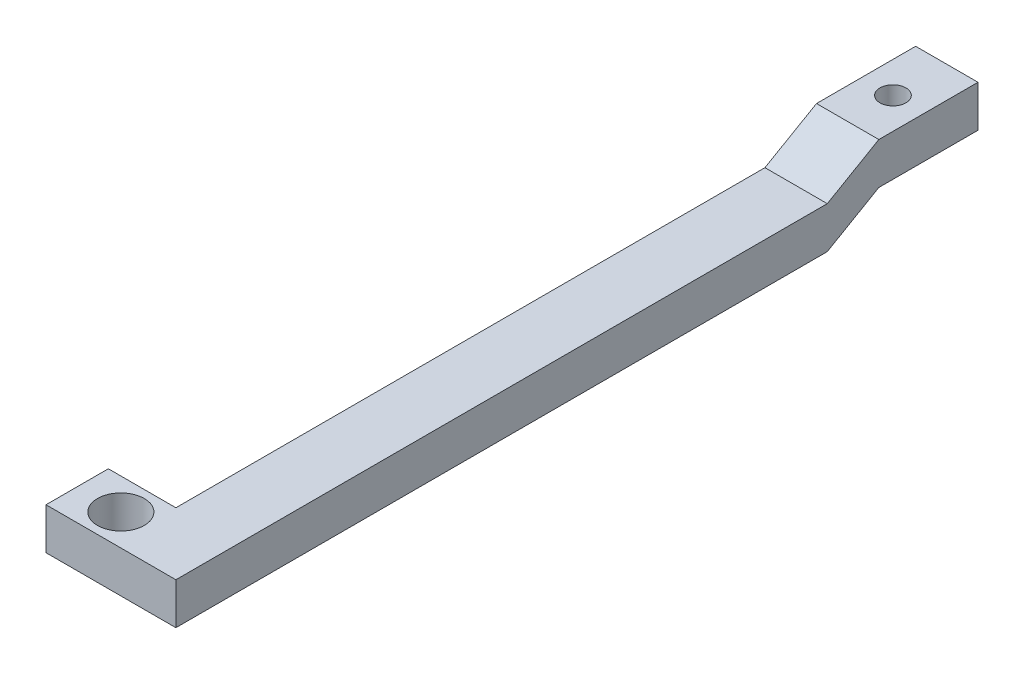
ISO-10303-21;
HEADER;
FILE_DESCRIPTION(('STEP AP214'),'2;1');
FILE_NAME('part.step','',(''),(''),'','','');
FILE_SCHEMA(('AUTOMOTIVE_DESIGN { 1 0 10303 214 1 1 1 1 }'));
ENDSEC;
DATA;
#1=APPLICATION_CONTEXT('core data for automotive mechanical design processes');
#2=APPLICATION_PROTOCOL_DEFINITION('international standard','automotive_design',2000,#1);
#3=PRODUCT_CONTEXT('',#1,'mechanical');
#4=PRODUCT('Part','Part','',(#3));
#5=PRODUCT_RELATED_PRODUCT_CATEGORY('part','',(#4));
#6=PRODUCT_DEFINITION_FORMATION('','',#4);
#7=PRODUCT_DEFINITION_CONTEXT('part definition',#1,'design');
#8=PRODUCT_DEFINITION('design','',#6,#7);
#9=PRODUCT_DEFINITION_SHAPE('','',#8);
#10=(LENGTH_UNIT() NAMED_UNIT(*) SI_UNIT(.MILLI.,.METRE.));
#11=(NAMED_UNIT(*) PLANE_ANGLE_UNIT() SI_UNIT($,.RADIAN.));
#12=(NAMED_UNIT(*) SI_UNIT($,.STERADIAN.) SOLID_ANGLE_UNIT());
#13=UNCERTAINTY_MEASURE_WITH_UNIT(LENGTH_MEASURE(1.E-05),#10,'distance_accuracy_value','');
#14=(GEOMETRIC_REPRESENTATION_CONTEXT(3) GLOBAL_UNCERTAINTY_ASSIGNED_CONTEXT((#13)) GLOBAL_UNIT_ASSIGNED_CONTEXT((#10,
#11,#12)) REPRESENTATION_CONTEXT('',''));
#15=CARTESIAN_POINT('',(0.,0.,0.));
#16=DIRECTION('',(0.,0.,1.));
#17=DIRECTION('',(1.,0.,0.));
#18=AXIS2_PLACEMENT_3D('',#15,#16,#17);
#19=CARTESIAN_POINT('',(-12.,0.,0.));
#20=DIRECTION('',(-1.,0.,0.));
#21=DIRECTION('',(0.,0.,1.));
#22=AXIS2_PLACEMENT_3D('',#19,#20,#21);
#23=PLANE('',#22);
#24=DIRECTION('',(0.,0.,-1.));
#25=VECTOR('',#24,1.);
#26=CARTESIAN_POINT('',(-12.,0.,0.));
#27=LINE('',#26,#25);
#28=CARTESIAN_POINT('',(-12.,0.,-12.));
#29=VERTEX_POINT('',#28);
#30=CARTESIAN_POINT('',(-12.,0.,-125.379462030105));
#31=VERTEX_POINT('',#30);
#32=EDGE_CURVE('E50',#29,#31,#27,.T.);
#33=ORIENTED_EDGE('',*,*,#32,.F.);
#34=DIRECTION('',(0.,1.,0.));
#35=VECTOR('',#34,1.);
#36=CARTESIAN_POINT('',(-12.,0.,-12.));
#37=LINE('',#36,#35);
#38=CARTESIAN_POINT('',(-12.,8.,-12.));
#39=VERTEX_POINT('',#38);
#40=EDGE_CURVE('E54',#29,#39,#37,.T.);
#41=ORIENTED_EDGE('',*,*,#40,.T.);
#42=DIRECTION('',(0.,0.,-1.));
#43=VECTOR('',#42,1.);
#44=CARTESIAN_POINT('',(-12.,8.,0.));
#45=LINE('',#44,#43);
#46=CARTESIAN_POINT('',(-12.,8.,-125.379462030105));
#47=VERTEX_POINT('',#46);
#48=EDGE_CURVE('E143',#39,#47,#45,.T.);
#49=ORIENTED_EDGE('',*,*,#48,.T.);
#50=DIRECTION('',(0.,-0.499999999999995,0.866025403784442));
#51=VECTOR('',#50,1.);
#52=CARTESIAN_POINT('',(-12.,13.73,-135.304113157475));
#53=LINE('',#52,#51);
#54=CARTESIAN_POINT('',(-12.,13.73,-135.304113157475));
#55=VERTEX_POINT('',#54);
#56=EDGE_CURVE('E145',#55,#47,#53,.T.);
#57=ORIENTED_EDGE('',*,*,#56,.F.);
#58=DIRECTION('',(0.,0.,1.));
#59=VECTOR('',#58,1.);
#60=CARTESIAN_POINT('',(-12.,13.73,-154.39));
#61=LINE('',#60,#59);
#62=CARTESIAN_POINT('',(-12.,13.73,-154.39));
#63=VERTEX_POINT('',#62);
#64=EDGE_CURVE('E149',#63,#55,#61,.T.);
#65=ORIENTED_EDGE('',*,*,#64,.F.);
#66=DIRECTION('',(0.,-1.,0.));
#67=VECTOR('',#66,1.);
#68=CARTESIAN_POINT('',(-12.,13.73,-154.39));
#69=LINE('',#68,#67);
#70=CARTESIAN_POINT('',(-12.,5.73,-154.39));
#71=VERTEX_POINT('',#70);
#72=EDGE_CURVE('E152',#63,#71,#69,.T.);
#73=ORIENTED_EDGE('',*,*,#72,.T.);
#74=DIRECTION('',(0.,0.,-1.));
#75=VECTOR('',#74,1.);
#76=CARTESIAN_POINT('',(-12.,5.72999999999999,-135.304113157475));
#77=LINE('',#76,#75);
#78=CARTESIAN_POINT('',(-12.,5.72999999999999,-135.304113157475));
#79=VERTEX_POINT('',#78);
#80=EDGE_CURVE('E154',#79,#71,#77,.T.);
#81=ORIENTED_EDGE('',*,*,#80,.F.);
#82=DIRECTION('',(0.,-0.499999999999995,0.866025403784442));
#83=VECTOR('',#82,1.);
#84=CARTESIAN_POINT('',(-12.,5.72999999999999,-135.304113157475));
#85=LINE('',#84,#83);
#86=EDGE_CURVE('E157',#79,#31,#85,.T.);
#87=ORIENTED_EDGE('',*,*,#86,.T.);
#88=EDGE_LOOP('',(#33,#41,#49,#57,#65,#73,#81,#87));
#89=FACE_BOUND('',#88,.T.);
#90=ADVANCED_FACE('F35',(#89),#23,.T.);
#91=CARTESIAN_POINT('',(-12.,0.,0.));
#92=DIRECTION('',(0.,0.,-1.));
#93=DIRECTION('',(-1.,0.,0.));
#94=AXIS2_PLACEMENT_3D('',#91,#92,#93);
#95=PLANE('',#94);
#96=DIRECTION('',(0.,1.,0.));
#97=VECTOR('',#96,1.);
#98=CARTESIAN_POINT('',(0.,0.,0.));
#99=LINE('',#98,#97);
#100=CARTESIAN_POINT('',(0.,0.,0.));
#101=VERTEX_POINT('',#100);
#102=CARTESIAN_POINT('',(0.,8.,0.));
#103=VERTEX_POINT('',#102);
#104=EDGE_CURVE('E114',#101,#103,#99,.T.);
#105=ORIENTED_EDGE('',*,*,#104,.T.);
#106=DIRECTION('',(1.,0.,0.));
#107=VECTOR('',#106,1.);
#108=CARTESIAN_POINT('',(-12.,8.,0.));
#109=LINE('',#108,#107);
#110=CARTESIAN_POINT('',(-25.,8.,0.));
#111=VERTEX_POINT('',#110);
#112=EDGE_CURVE('E11',#111,#103,#109,.T.);
#113=ORIENTED_EDGE('',*,*,#112,.F.);
#114=DIRECTION('',(0.,1.,0.));
#115=VECTOR('',#114,1.);
#116=CARTESIAN_POINT('',(-25.,0.,0.));
#117=LINE('',#116,#115);
#118=CARTESIAN_POINT('',(-25.,0.,0.));
#119=VERTEX_POINT('',#118);
#120=EDGE_CURVE('E111',#119,#111,#117,.T.);
#121=ORIENTED_EDGE('',*,*,#120,.F.);
#122=DIRECTION('',(1.,0.,0.));
#123=VECTOR('',#122,1.);
#124=CARTESIAN_POINT('',(-12.,0.,0.));
#125=LINE('',#124,#123);
#126=EDGE_CURVE('E160',#119,#101,#125,.T.);
#127=ORIENTED_EDGE('',*,*,#126,.T.);
#128=EDGE_LOOP('',(#105,#113,#121,#127));
#129=FACE_BOUND('',#128,.T.);
#130=ADVANCED_FACE('F37',(#129),#95,.F.);
#131=CARTESIAN_POINT('',(-12.,8.,0.));
#132=DIRECTION('',(0.,-1.,0.));
#133=DIRECTION('',(0.,0.,-1.));
#134=AXIS2_PLACEMENT_3D('',#131,#132,#133);
#135=PLANE('',#134);
#136=CARTESIAN_POINT('',(-16.59,8.,-6.00000000000001));
#137=DIRECTION('',(0.,1.,0.));
#138=DIRECTION('',(0.,0.,1.));
#139=AXIS2_PLACEMENT_3D('',#136,#137,#138);
#140=CIRCLE('',#139,4.5);
#141=CARTESIAN_POINT('',(-16.59,8.,-1.5));
#142=VERTEX_POINT('',#141);
#143=EDGE_CURVE('E128',#142,#142,#140,.T.);
#144=ORIENTED_EDGE('',*,*,#143,.F.);
#145=EDGE_LOOP('',(#144));
#146=FACE_BOUND('',#145,.T.);
#147=DIRECTION('',(0.,0.,-1.));
#148=VECTOR('',#147,1.);
#149=CARTESIAN_POINT('',(0.,8.,0.));
#150=LINE('',#149,#148);
#151=CARTESIAN_POINT('',(0.,8.,-125.379462030105));
#152=VERTEX_POINT('',#151);
#153=EDGE_CURVE('E162',#103,#152,#150,.T.);
#154=ORIENTED_EDGE('',*,*,#153,.T.);
#155=DIRECTION('',(1.,0.,0.));
#156=VECTOR('',#155,1.);
#157=CARTESIAN_POINT('',(-12.,8.,-125.379462030105));
#158=LINE('',#157,#156);
#159=EDGE_CURVE('E43',#47,#152,#158,.T.);
#160=ORIENTED_EDGE('',*,*,#159,.F.);
#161=ORIENTED_EDGE('',*,*,#48,.F.);
#162=DIRECTION('',(1.,0.,0.));
#163=VECTOR('',#162,1.);
#164=CARTESIAN_POINT('',(-25.,8.,-12.));
#165=LINE('',#164,#163);
#166=CARTESIAN_POINT('',(-25.,8.,-12.));
#167=VERTEX_POINT('',#166);
#168=EDGE_CURVE('E127',#167,#39,#165,.T.);
#169=ORIENTED_EDGE('',*,*,#168,.F.);
#170=DIRECTION('',(0.,0.,-1.));
#171=VECTOR('',#170,1.);
#172=CARTESIAN_POINT('',(-25.,8.,0.));
#173=LINE('',#172,#171);
#174=EDGE_CURVE('E120',#111,#167,#173,.T.);
#175=ORIENTED_EDGE('',*,*,#174,.F.);
#176=ORIENTED_EDGE('',*,*,#112,.T.);
#177=EDGE_LOOP('',(#154,#160,#161,#169,#175,#176));
#178=FACE_BOUND('',#177,.T.);
#179=ADVANCED_FACE('F125',(#146,#178),#135,.F.);
#180=CARTESIAN_POINT('',(-12.,13.73,-135.304113157475));
#181=DIRECTION('',(0.,0.866025403784441,0.499999999999995));
#182=DIRECTION('',(0.,-0.499999999999995,0.866025403784442));
#183=AXIS2_PLACEMENT_3D('',#180,#181,#182);
#184=PLANE('',#183);
#185=DIRECTION('',(0.,-0.499999999999995,0.866025403784442));
#186=VECTOR('',#185,1.);
#187=CARTESIAN_POINT('',(0.,13.73,-135.304113157475));
#188=LINE('',#187,#186);
#189=CARTESIAN_POINT('',(0.,13.73,-135.304113157475));
#190=VERTEX_POINT('',#189);
#191=EDGE_CURVE('E164',#190,#152,#188,.T.);
#192=ORIENTED_EDGE('',*,*,#191,.F.);
#193=DIRECTION('',(1.,0.,0.));
#194=VECTOR('',#193,1.);
#195=CARTESIAN_POINT('',(-12.,13.73,-135.304113157475));
#196=LINE('',#195,#194);
#197=EDGE_CURVE('E190',#55,#190,#196,.T.);
#198=ORIENTED_EDGE('',*,*,#197,.F.);
#199=ORIENTED_EDGE('',*,*,#56,.T.);
#200=ORIENTED_EDGE('',*,*,#159,.T.);
#201=EDGE_LOOP('',(#192,#198,#199,#200));
#202=FACE_BOUND('',#201,.T.);
#203=ADVANCED_FACE('F195',(#202),#184,.T.);
#204=CARTESIAN_POINT('',(-12.,13.73,-154.39));
#205=DIRECTION('',(0.,1.,0.));
#206=DIRECTION('',(0.,0.,1.));
#207=AXIS2_PLACEMENT_3D('',#204,#205,#206);
#208=PLANE('',#207);
#209=CARTESIAN_POINT('',(-6.,13.73,-144.02));
#210=DIRECTION('',(0.,1.,0.));
#211=DIRECTION('',(0.,0.,1.));
#212=AXIS2_PLACEMENT_3D('',#209,#210,#211);
#213=CIRCLE('',#212,2.5);
#214=CARTESIAN_POINT('',(-6.,13.73,-141.52));
#215=VERTEX_POINT('',#214);
#216=EDGE_CURVE('E358',#215,#215,#213,.T.);
#217=ORIENTED_EDGE('',*,*,#216,.F.);
#218=EDGE_LOOP('',(#217));
#219=FACE_BOUND('',#218,.T.);
#220=DIRECTION('',(0.,0.,1.));
#221=VECTOR('',#220,1.);
#222=CARTESIAN_POINT('',(0.,13.73,-154.39));
#223=LINE('',#222,#221);
#224=CARTESIAN_POINT('',(0.,13.73,-154.39));
#225=VERTEX_POINT('',#224);
#226=EDGE_CURVE('E167',#225,#190,#223,.T.);
#227=ORIENTED_EDGE('',*,*,#226,.F.);
#228=DIRECTION('',(1.,0.,0.));
#229=VECTOR('',#228,1.);
#230=CARTESIAN_POINT('',(-12.,13.73,-154.39));
#231=LINE('',#230,#229);
#232=EDGE_CURVE('E188',#63,#225,#231,.T.);
#233=ORIENTED_EDGE('',*,*,#232,.F.);
#234=ORIENTED_EDGE('',*,*,#64,.T.);
#235=ORIENTED_EDGE('',*,*,#197,.T.);
#236=EDGE_LOOP('',(#227,#233,#234,#235));
#237=FACE_BOUND('',#236,.T.);
#238=ADVANCED_FACE('F202',(#219,#237),#208,.T.);
#239=CARTESIAN_POINT('',(-12.,13.73,-154.39));
#240=DIRECTION('',(0.,0.,1.));
#241=DIRECTION('',(0.,-1.,0.));
#242=AXIS2_PLACEMENT_3D('',#239,#240,#241);
#243=PLANE('',#242);
#244=DIRECTION('',(0.,-1.,0.));
#245=VECTOR('',#244,1.);
#246=CARTESIAN_POINT('',(0.,13.73,-154.39));
#247=LINE('',#246,#245);
#248=CARTESIAN_POINT('',(0.,5.73,-154.39));
#249=VERTEX_POINT('',#248);
#250=EDGE_CURVE('E170',#225,#249,#247,.T.);
#251=ORIENTED_EDGE('',*,*,#250,.T.);
#252=DIRECTION('',(1.,0.,0.));
#253=VECTOR('',#252,1.);
#254=CARTESIAN_POINT('',(-12.,5.73,-154.39));
#255=LINE('',#254,#253);
#256=EDGE_CURVE('E186',#71,#249,#255,.T.);
#257=ORIENTED_EDGE('',*,*,#256,.F.);
#258=ORIENTED_EDGE('',*,*,#72,.F.);
#259=ORIENTED_EDGE('',*,*,#232,.T.);
#260=EDGE_LOOP('',(#251,#257,#258,#259));
#261=FACE_BOUND('',#260,.T.);
#262=ADVANCED_FACE('F222',(#261),#243,.F.);
#263=CARTESIAN_POINT('',(-12.,5.72999999999999,-135.304113157475));
#264=DIRECTION('',(0.,-1.,0.));
#265=DIRECTION('',(0.,0.,-1.));
#266=AXIS2_PLACEMENT_3D('',#263,#264,#265);
#267=PLANE('',#266);
#268=CARTESIAN_POINT('',(-6.,5.72999999999999,-144.02));
#269=DIRECTION('',(0.,-1.,0.));
#270=DIRECTION('',(0.,0.,-1.));
#271=AXIS2_PLACEMENT_3D('',#268,#269,#270);
#272=CIRCLE('',#271,2.5);
#273=CARTESIAN_POINT('',(-6.,5.72999999999999,-141.52));
#274=VERTEX_POINT('',#273);
#275=EDGE_CURVE('E355',#274,#274,#272,.F.);
#276=ORIENTED_EDGE('',*,*,#275,.T.);
#277=EDGE_LOOP('',(#276));
#278=FACE_BOUND('',#277,.T.);
#279=DIRECTION('',(0.,0.,-1.));
#280=VECTOR('',#279,1.);
#281=CARTESIAN_POINT('',(0.,5.72999999999999,-135.304113157475));
#282=LINE('',#281,#280);
#283=CARTESIAN_POINT('',(0.,5.72999999999999,-135.304113157475));
#284=VERTEX_POINT('',#283);
#285=EDGE_CURVE('E173',#284,#249,#282,.T.);
#286=ORIENTED_EDGE('',*,*,#285,.F.);
#287=DIRECTION('',(1.,0.,0.));
#288=VECTOR('',#287,1.);
#289=CARTESIAN_POINT('',(-12.,5.72999999999999,-135.304113157475));
#290=LINE('',#289,#288);
#291=EDGE_CURVE('E184',#79,#284,#290,.T.);
#292=ORIENTED_EDGE('',*,*,#291,.F.);
#293=ORIENTED_EDGE('',*,*,#80,.T.);
#294=ORIENTED_EDGE('',*,*,#256,.T.);
#295=EDGE_LOOP('',(#286,#292,#293,#294));
#296=FACE_BOUND('',#295,.T.);
#297=ADVANCED_FACE('F219',(#278,#296),#267,.T.);
#298=CARTESIAN_POINT('',(-12.,5.72999999999999,-135.304113157475));
#299=DIRECTION('',(0.,0.866025403784441,0.499999999999995));
#300=DIRECTION('',(0.,-0.499999999999995,0.866025403784442));
#301=AXIS2_PLACEMENT_3D('',#298,#299,#300);
#302=PLANE('',#301);
#303=DIRECTION('',(0.,-0.499999999999995,0.866025403784442));
#304=VECTOR('',#303,1.);
#305=CARTESIAN_POINT('',(0.,5.72999999999999,-135.304113157475));
#306=LINE('',#305,#304);
#307=CARTESIAN_POINT('',(0.,0.,-125.379462030105));
#308=VERTEX_POINT('',#307);
#309=EDGE_CURVE('E176',#284,#308,#306,.T.);
#310=ORIENTED_EDGE('',*,*,#309,.T.);
#311=DIRECTION('',(1.,0.,0.));
#312=VECTOR('',#311,1.);
#313=CARTESIAN_POINT('',(-12.,0.,-125.379462030105));
#314=LINE('',#313,#312);
#315=EDGE_CURVE('E181',#31,#308,#314,.T.);
#316=ORIENTED_EDGE('',*,*,#315,.F.);
#317=ORIENTED_EDGE('',*,*,#86,.F.);
#318=ORIENTED_EDGE('',*,*,#291,.T.);
#319=EDGE_LOOP('',(#310,#316,#317,#318));
#320=FACE_BOUND('',#319,.T.);
#321=ADVANCED_FACE('F216',(#320),#302,.F.);
#322=CARTESIAN_POINT('',(-12.,0.,0.));
#323=DIRECTION('',(0.,-1.,0.));
#324=DIRECTION('',(0.,0.,-1.));
#325=AXIS2_PLACEMENT_3D('',#322,#323,#324);
#326=PLANE('',#325);
#327=CARTESIAN_POINT('',(-16.59,0.,-6.00000000000001));
#328=DIRECTION('',(0.,-1.,0.));
#329=DIRECTION('',(0.,0.,-1.));
#330=AXIS2_PLACEMENT_3D('',#327,#328,#329);
#331=CIRCLE('',#330,4.5);
#332=CARTESIAN_POINT('',(-16.59,0.,-10.5));
#333=VERTEX_POINT('',#332);
#334=EDGE_CURVE('E131',#333,#333,#331,.F.);
#335=ORIENTED_EDGE('',*,*,#334,.T.);
#336=EDGE_LOOP('',(#335));
#337=FACE_BOUND('',#336,.T.);
#338=DIRECTION('',(1.,0.,0.));
#339=VECTOR('',#338,1.);
#340=CARTESIAN_POINT('',(-25.,0.,-12.));
#341=LINE('',#340,#339);
#342=CARTESIAN_POINT('',(-25.,0.,-12.));
#343=VERTEX_POINT('',#342);
#344=EDGE_CURVE('E138',#343,#29,#341,.T.);
#345=ORIENTED_EDGE('',*,*,#344,.T.);
#346=ORIENTED_EDGE('',*,*,#32,.T.);
#347=ORIENTED_EDGE('',*,*,#315,.T.);
#348=DIRECTION('',(0.,0.,-1.));
#349=VECTOR('',#348,1.);
#350=CARTESIAN_POINT('',(0.,0.,0.));
#351=LINE('',#350,#349);
#352=EDGE_CURVE('E146',#101,#308,#351,.T.);
#353=ORIENTED_EDGE('',*,*,#352,.F.);
#354=ORIENTED_EDGE('',*,*,#126,.F.);
#355=DIRECTION('',(0.,0.,-1.));
#356=VECTOR('',#355,1.);
#357=CARTESIAN_POINT('',(-25.,0.,0.));
#358=LINE('',#357,#356);
#359=EDGE_CURVE('E123',#119,#343,#358,.T.);
#360=ORIENTED_EDGE('',*,*,#359,.T.);
#361=EDGE_LOOP('',(#345,#346,#347,#353,#354,#360));
#362=FACE_BOUND('',#361,.T.);
#363=ADVANCED_FACE('F209',(#337,#362),#326,.T.);
#364=CARTESIAN_POINT('',(0.,0.,0.));
#365=DIRECTION('',(-1.,0.,0.));
#366=DIRECTION('',(0.,0.,1.));
#367=AXIS2_PLACEMENT_3D('',#364,#365,#366);
#368=PLANE('',#367);
#369=ORIENTED_EDGE('',*,*,#352,.T.);
#370=ORIENTED_EDGE('',*,*,#309,.F.);
#371=ORIENTED_EDGE('',*,*,#285,.T.);
#372=ORIENTED_EDGE('',*,*,#250,.F.);
#373=ORIENTED_EDGE('',*,*,#226,.T.);
#374=ORIENTED_EDGE('',*,*,#191,.T.);
#375=ORIENTED_EDGE('',*,*,#153,.F.);
#376=ORIENTED_EDGE('',*,*,#104,.F.);
#377=EDGE_LOOP('',(#369,#370,#371,#372,#373,#374,#375,#376));
#378=FACE_BOUND('',#377,.T.);
#379=ADVANCED_FACE('F198',(#378),#368,.F.);
#380=CARTESIAN_POINT('',(-25.,0.,-12.));
#381=DIRECTION('',(0.,0.,1.));
#382=DIRECTION('',(0.,-1.,0.));
#383=AXIS2_PLACEMENT_3D('',#380,#381,#382);
#384=PLANE('',#383);
#385=ORIENTED_EDGE('',*,*,#40,.F.);
#386=ORIENTED_EDGE('',*,*,#344,.F.);
#387=DIRECTION('',(0.,-1.,0.));
#388=VECTOR('',#387,1.);
#389=CARTESIAN_POINT('',(-25.,0.,-12.));
#390=LINE('',#389,#388);
#391=EDGE_CURVE('E136',#167,#343,#390,.T.);
#392=ORIENTED_EDGE('',*,*,#391,.F.);
#393=ORIENTED_EDGE('',*,*,#168,.T.);
#394=EDGE_LOOP('',(#385,#386,#392,#393));
#395=FACE_BOUND('',#394,.T.);
#396=ADVANCED_FACE('F206',(#395),#384,.F.);
#397=CARTESIAN_POINT('',(-25.,0.,0.));
#398=DIRECTION('',(1.,0.,0.));
#399=DIRECTION('',(0.,0.,-1.));
#400=AXIS2_PLACEMENT_3D('',#397,#398,#399);
#401=PLANE('',#400);
#402=ORIENTED_EDGE('',*,*,#174,.T.);
#403=ORIENTED_EDGE('',*,*,#391,.T.);
#404=ORIENTED_EDGE('',*,*,#359,.F.);
#405=ORIENTED_EDGE('',*,*,#120,.T.);
#406=EDGE_LOOP('',(#402,#403,#404,#405));
#407=FACE_BOUND('',#406,.T.);
#408=ADVANCED_FACE('F119',(#407),#401,.F.);
#409=CARTESIAN_POINT('',(-16.59,-0.000999999999999265,-6.00000000000001));
#410=DIRECTION('',(0.,1.,0.));
#411=DIRECTION('',(0.,0.,1.));
#412=AXIS2_PLACEMENT_3D('',#409,#410,#411);
#413=CYLINDRICAL_SURFACE('',#412,4.5);
#414=ORIENTED_EDGE('',*,*,#334,.F.);
#415=EDGE_LOOP('',(#414));
#416=FACE_BOUND('',#415,.T.);
#417=ORIENTED_EDGE('',*,*,#143,.T.);
#418=EDGE_LOOP('',(#417));
#419=FACE_BOUND('',#418,.T.);
#420=ADVANCED_FACE('F273',(#416,#419),#413,.F.);
#421=CARTESIAN_POINT('',(-6.,-0.000999999999999265,-144.02));
#422=DIRECTION('',(0.,1.,0.));
#423=DIRECTION('',(0.,0.,1.));
#424=AXIS2_PLACEMENT_3D('',#421,#422,#423);
#425=CYLINDRICAL_SURFACE('',#424,2.5);
#426=CARTESIAN_POINT('',(-6.,5.72999999999999,-141.52));
#427=CARTESIAN_POINT('',(-6.,5.81333333333333,-141.52));
#428=CARTESIAN_POINT('',(-6.,5.89666666666666,-141.52));
#429=CARTESIAN_POINT('',(-6.,6.06333333333333,-141.52));
#430=CARTESIAN_POINT('',(-6.,6.14666666666666,-141.52));
#431=CARTESIAN_POINT('',(-6.,6.31333333333333,-141.52));
#432=CARTESIAN_POINT('',(-6.,6.39666666666666,-141.52));
#433=CARTESIAN_POINT('',(-6.,6.56333333333333,-141.52));
#434=CARTESIAN_POINT('',(-6.,6.64666666666666,-141.52));
#435=CARTESIAN_POINT('',(-6.,6.81333333333333,-141.52));
#436=CARTESIAN_POINT('',(-6.,6.89666666666666,-141.52));
#437=CARTESIAN_POINT('',(-6.,7.06333333333333,-141.52));
#438=CARTESIAN_POINT('',(-6.,7.14666666666666,-141.52));
#439=CARTESIAN_POINT('',(-6.,7.31333333333333,-141.52));
#440=CARTESIAN_POINT('',(-6.,7.39666666666666,-141.52));
#441=CARTESIAN_POINT('',(-6.,7.56333333333333,-141.52));
#442=CARTESIAN_POINT('',(-6.,7.64666666666666,-141.52));
#443=CARTESIAN_POINT('',(-6.,7.81333333333333,-141.52));
#444=CARTESIAN_POINT('',(-6.,7.89666666666666,-141.52));
#445=CARTESIAN_POINT('',(-6.,8.06333333333333,-141.52));
#446=CARTESIAN_POINT('',(-6.,8.14666666666666,-141.52));
#447=CARTESIAN_POINT('',(-6.,8.31333333333333,-141.52));
#448=CARTESIAN_POINT('',(-6.,8.39666666666666,-141.52));
#449=CARTESIAN_POINT('',(-6.,8.56333333333333,-141.52));
#450=CARTESIAN_POINT('',(-6.,8.64666666666666,-141.52));
#451=CARTESIAN_POINT('',(-6.,8.81333333333333,-141.52));
#452=CARTESIAN_POINT('',(-6.,8.89666666666666,-141.52));
#453=CARTESIAN_POINT('',(-6.,9.06333333333333,-141.52));
#454=CARTESIAN_POINT('',(-6.,9.14666666666666,-141.52));
#455=CARTESIAN_POINT('',(-6.,9.31333333333333,-141.52));
#456=CARTESIAN_POINT('',(-6.,9.39666666666666,-141.52));
#457=CARTESIAN_POINT('',(-6.,9.56333333333333,-141.52));
#458=CARTESIAN_POINT('',(-6.,9.64666666666666,-141.52));
#459=CARTESIAN_POINT('',(-6.,9.81333333333333,-141.52));
#460=CARTESIAN_POINT('',(-6.,9.89666666666666,-141.52));
#461=CARTESIAN_POINT('',(-6.,10.0633333333333,-141.52));
#462=CARTESIAN_POINT('',(-6.,10.1466666666667,-141.52));
#463=CARTESIAN_POINT('',(-6.,10.3133333333333,-141.52));
#464=CARTESIAN_POINT('',(-6.,10.3966666666667,-141.52));
#465=CARTESIAN_POINT('',(-6.,10.5633333333333,-141.52));
#466=CARTESIAN_POINT('',(-6.,10.6466666666667,-141.52));
#467=CARTESIAN_POINT('',(-6.,10.8133333333333,-141.52));
#468=CARTESIAN_POINT('',(-6.,10.8966666666667,-141.52));
#469=CARTESIAN_POINT('',(-6.,11.0633333333333,-141.52));
#470=CARTESIAN_POINT('',(-6.,11.1466666666667,-141.52));
#471=CARTESIAN_POINT('',(-6.,11.3133333333333,-141.52));
#472=CARTESIAN_POINT('',(-6.,11.3966666666667,-141.52));
#473=CARTESIAN_POINT('',(-6.,11.5633333333333,-141.52));
#474=CARTESIAN_POINT('',(-6.,11.6466666666667,-141.52));
#475=CARTESIAN_POINT('',(-6.,11.8133333333333,-141.52));
#476=CARTESIAN_POINT('',(-6.,11.8966666666667,-141.52));
#477=CARTESIAN_POINT('',(-6.,12.0633333333333,-141.52));
#478=CARTESIAN_POINT('',(-6.,12.1466666666667,-141.52));
#479=CARTESIAN_POINT('',(-6.,12.3133333333333,-141.52));
#480=CARTESIAN_POINT('',(-6.,12.3966666666667,-141.52));
#481=CARTESIAN_POINT('',(-6.,12.5633333333333,-141.52));
#482=CARTESIAN_POINT('',(-6.,12.6466666666667,-141.52));
#483=CARTESIAN_POINT('',(-6.,12.8133333333333,-141.52));
#484=CARTESIAN_POINT('',(-6.,12.8966666666667,-141.52));
#485=CARTESIAN_POINT('',(-6.,13.0633333333333,-141.52));
#486=CARTESIAN_POINT('',(-6.,13.1466666666667,-141.52));
#487=CARTESIAN_POINT('',(-6.,13.3133333333333,-141.52));
#488=CARTESIAN_POINT('',(-6.,13.3966666666667,-141.52));
#489=CARTESIAN_POINT('',(-6.,13.5633333333333,-141.52));
#490=CARTESIAN_POINT('',(-6.,13.6466666666667,-141.52));
#491=CARTESIAN_POINT('',(-6.,13.73,-141.52));
#492=B_SPLINE_CURVE_WITH_KNOTS('',3,(#426,#427,#428,#429,#430,#431,#432,#433,#434,#435,#436,
#437,#438,#439,#440,#441,#442,#443,#444,#445,#446,#447,#448,#449,#450,#451,#452,#453,#454,#455,
#456,#457,#458,#459,#460,#461,#462,#463,#464,#465,#466,#467,#468,#469,#470,#471,#472,#473,#474,
#475,#476,#477,#478,#479,#480,#481,#482,#483,#484,#485,#486,#487,#488,#489,#490,#491),
.UNSPECIFIED.,.F.,.F.,(4,2,2,2,2,2,2,2,2,2,2,2,2,2,2,2,2,2,2,2,2,2,2,2,2,2,2,2,2,2,2,2,4),(0.,
0.25,0.5,0.750000000000001,1.,1.25,1.5,1.75,2.,2.25,2.5,2.75,3.,3.25,3.5,3.75,4.,4.25,4.5,4.75,
5.,5.25,5.5,5.75,6.,6.25,6.5,6.75,7.,7.25,7.5,7.75,8.),.UNSPECIFIED.);
#493=EDGE_CURVE('BSEAM278',#274,#215,#492,.T.);
#494=ORIENTED_EDGE('',*,*,#275,.F.);
#495=ORIENTED_EDGE('',*,*,#216,.T.);
#496=ORIENTED_EDGE('',*,*,#493,.T.);
#497=ORIENTED_EDGE('',*,*,#493,.F.);
#498=EDGE_LOOP('',(#494,#496,#495,#497));
#499=FACE_BOUND('',#498,.T.);
#500=ADVANCED_FACE('F278',(#499),#425,.F.);
#501=CLOSED_SHELL('',(#90,#130,#179,#203,#238,#262,#297,#321,#363,#379,#396,#408,#420,#500));
#502=MANIFOLD_SOLID_BREP('B2',#501);
#503=ADVANCED_BREP_SHAPE_REPRESENTATION('',(#18,#502),#14);
#504=SHAPE_DEFINITION_REPRESENTATION(#9,#503);
ENDSEC;
END-ISO-10303-21;
